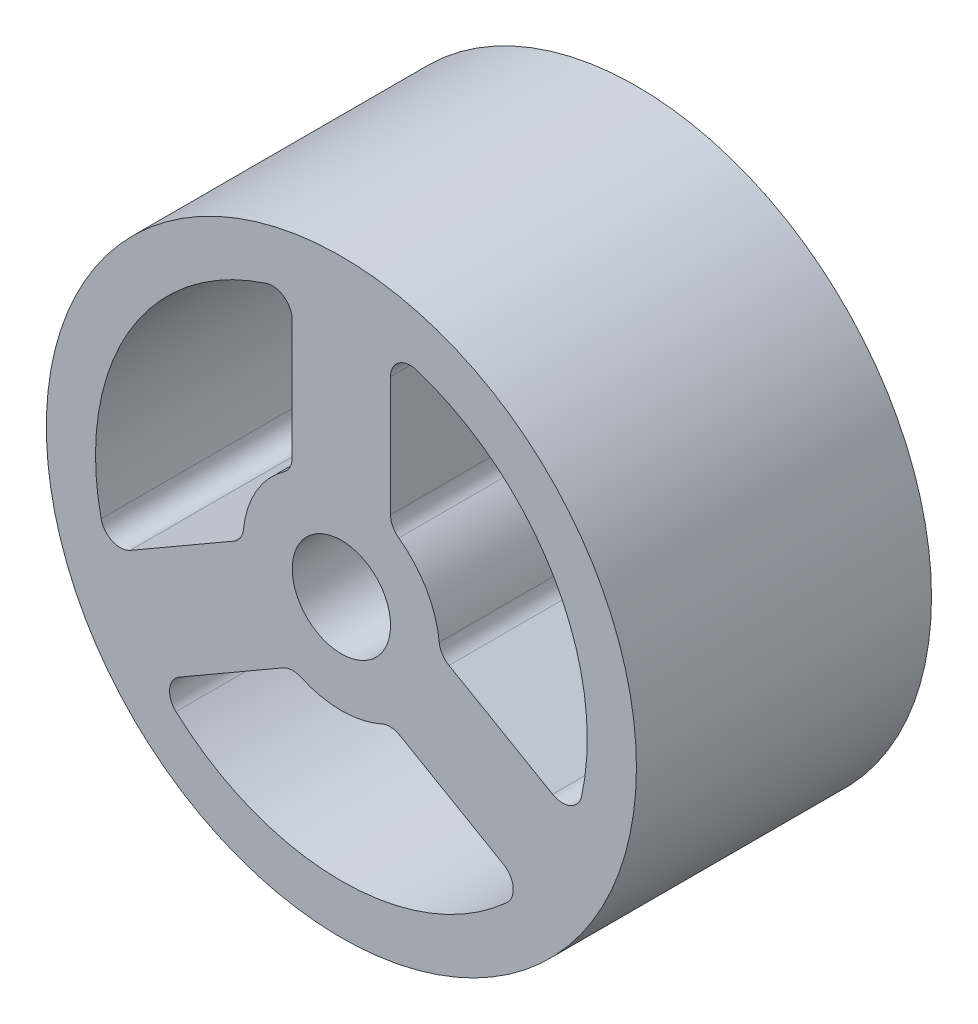
ISO-10303-21;
HEADER;
FILE_DESCRIPTION(('STEP AP214'),'2;1');
FILE_NAME('part.step','',(''),(''),'','','');
FILE_SCHEMA(('AUTOMOTIVE_DESIGN { 1 0 10303 214 1 1 1 1 }'));
ENDSEC;
DATA;
#1=APPLICATION_CONTEXT('core data for automotive mechanical design processes');
#2=APPLICATION_PROTOCOL_DEFINITION('international standard','automotive_design',2000,#1);
#3=PRODUCT_CONTEXT('',#1,'mechanical');
#4=PRODUCT('Part','Part','',(#3));
#5=PRODUCT_RELATED_PRODUCT_CATEGORY('part','',(#4));
#6=PRODUCT_DEFINITION_FORMATION('','',#4);
#7=PRODUCT_DEFINITION_CONTEXT('part definition',#1,'design');
#8=PRODUCT_DEFINITION('design','',#6,#7);
#9=PRODUCT_DEFINITION_SHAPE('','',#8);
#10=(LENGTH_UNIT() NAMED_UNIT(*) SI_UNIT(.MILLI.,.METRE.));
#11=(NAMED_UNIT(*) PLANE_ANGLE_UNIT() SI_UNIT($,.RADIAN.));
#12=(NAMED_UNIT(*) SI_UNIT($,.STERADIAN.) SOLID_ANGLE_UNIT());
#13=UNCERTAINTY_MEASURE_WITH_UNIT(LENGTH_MEASURE(1.E-05),#10,'distance_accuracy_value','');
#14=(GEOMETRIC_REPRESENTATION_CONTEXT(3) GLOBAL_UNCERTAINTY_ASSIGNED_CONTEXT((#13)) GLOBAL_UNIT_ASSIGNED_CONTEXT((#10,
#11,#12)) REPRESENTATION_CONTEXT('',''));
#15=CARTESIAN_POINT('',(0.,0.,0.));
#16=DIRECTION('',(0.,0.,1.));
#17=DIRECTION('',(1.,0.,0.));
#18=AXIS2_PLACEMENT_3D('',#15,#16,#17);
#19=CARTESIAN_POINT('',(0.,0.,30.));
#20=DIRECTION('',(0.,0.,-1.));
#21=DIRECTION('',(-1.,0.,0.));
#22=AXIS2_PLACEMENT_3D('',#19,#20,#21);
#23=CYLINDRICAL_SURFACE('',#22,10.);
#24=CARTESIAN_POINT('',(0.,0.,0.));
#25=DIRECTION('',(0.,0.,1.));
#26=DIRECTION('',(1.,0.,0.));
#27=AXIS2_PLACEMENT_3D('',#24,#25,#26);
#28=CIRCLE('',#27,10.);
#29=CARTESIAN_POINT('',(-5.83333333333333,8.12232862067414,0.));
#30=VERTEX_POINT('',#29);
#31=CARTESIAN_POINT('',(-9.95080959005588,0.990650545072255,0.));
#32=VERTEX_POINT('',#31);
#33=EDGE_CURVE('E248',#30,#32,#28,.T.);
#34=ORIENTED_EDGE('',*,*,#33,.T.);
#35=DIRECTION('',(0.,0.,-1.));
#36=VECTOR('',#35,1.);
#37=CARTESIAN_POINT('',(-9.95080959005588,0.990650545072255,30.));
#38=LINE('',#37,#36);
#39=CARTESIAN_POINT('',(-9.95080959005588,0.990650545072255,30.));
#40=VERTEX_POINT('',#39);
#41=EDGE_CURVE('E11',#40,#32,#38,.T.);
#42=ORIENTED_EDGE('',*,*,#41,.F.);
#43=CARTESIAN_POINT('',(0.,0.,30.));
#44=DIRECTION('',(0.,0.,1.));
#45=DIRECTION('',(1.,0.,0.));
#46=AXIS2_PLACEMENT_3D('',#43,#44,#45);
#47=CIRCLE('',#46,10.);
#48=CARTESIAN_POINT('',(-5.83333333333333,8.12232862067414,30.));
#49=VERTEX_POINT('',#48);
#50=EDGE_CURVE('E401',#49,#40,#47,.T.);
#51=ORIENTED_EDGE('',*,*,#50,.F.);
#52=DIRECTION('',(0.,0.,-1.));
#53=VECTOR('',#52,1.);
#54=CARTESIAN_POINT('',(-5.83333333333333,8.12232862067414,30.));
#55=LINE('',#54,#53);
#56=EDGE_CURVE('E302',#49,#30,#55,.T.);
#57=ORIENTED_EDGE('',*,*,#56,.T.);
#58=EDGE_LOOP('',(#34,#42,#51,#57));
#59=FACE_BOUND('',#58,.T.);
#60=ADVANCED_FACE('F39',(#59),#23,.T.);
#61=CARTESIAN_POINT('',(-11.9409715080671,1.18878065408671,30.));
#62=DIRECTION('',(0.,0.,-1.));
#63=DIRECTION('',(-1.,0.,0.));
#64=AXIS2_PLACEMENT_3D('',#61,#62,#63);
#65=CYLINDRICAL_SURFACE('',#64,2.);
#66=CARTESIAN_POINT('',(-11.9409715080671,1.18878065408671,0.));
#67=DIRECTION('',(0.,0.,1.));
#68=DIRECTION('',(1.,0.,0.));
#69=AXIS2_PLACEMENT_3D('',#66,#67,#68);
#70=CIRCLE('',#69,2.);
#71=CARTESIAN_POINT('',(-10.9409715080671,-0.543270153482182,0.));
#72=VERTEX_POINT('',#71);
#73=EDGE_CURVE('E283',#72,#32,#70,.T.);
#74=ORIENTED_EDGE('',*,*,#73,.F.);
#75=DIRECTION('',(0.,0.,-1.));
#76=VECTOR('',#75,1.);
#77=CARTESIAN_POINT('',(-10.9409715080671,-0.543270153482182,30.));
#78=LINE('',#77,#76);
#79=CARTESIAN_POINT('',(-10.9409715080671,-0.543270153482182,30.));
#80=VERTEX_POINT('',#79);
#81=EDGE_CURVE('E49',#80,#72,#78,.T.);
#82=ORIENTED_EDGE('',*,*,#81,.F.);
#83=CARTESIAN_POINT('',(-11.9409715080671,1.18878065408671,30.));
#84=DIRECTION('',(0.,0.,1.));
#85=DIRECTION('',(1.,0.,0.));
#86=AXIS2_PLACEMENT_3D('',#83,#84,#85);
#87=CIRCLE('',#86,2.);
#88=EDGE_CURVE('E402',#80,#40,#87,.T.);
#89=ORIENTED_EDGE('',*,*,#88,.T.);
#90=ORIENTED_EDGE('',*,*,#41,.T.);
#91=EDGE_LOOP('',(#74,#82,#89,#90));
#92=FACE_BOUND('',#91,.T.);
#93=ADVANCED_FACE('F444',(#92),#65,.F.);
#94=CARTESIAN_POINT('',(-2.49999999999996,4.33012701892222,30.));
#95=DIRECTION('',(-0.499999999999992,0.866025403784443,0.));
#96=DIRECTION('',(-0.866025403784443,-0.499999999999992,0.));
#97=AXIS2_PLACEMENT_3D('',#94,#95,#96);
#98=PLANE('',#97);
#99=DIRECTION('',(0.866025403784443,0.499999999999992,0.));
#100=VECTOR('',#99,1.);
#101=CARTESIAN_POINT('',(-2.49999999999996,4.33012701892222,0.));
#102=LINE('',#101,#100);
#103=CARTESIAN_POINT('',(-21.4736659610103,-6.62432413118093,0.));
#104=VERTEX_POINT('',#103);
#105=EDGE_CURVE('E286',#104,#72,#102,.T.);
#106=ORIENTED_EDGE('',*,*,#105,.F.);
#107=DIRECTION('',(0.,0.,-1.));
#108=VECTOR('',#107,1.);
#109=CARTESIAN_POINT('',(-21.4736659610103,-6.62432413118093,30.));
#110=LINE('',#109,#108);
#111=CARTESIAN_POINT('',(-21.4736659610103,-6.62432413118093,30.));
#112=VERTEX_POINT('',#111);
#113=EDGE_CURVE('E309',#112,#104,#110,.T.);
#114=ORIENTED_EDGE('',*,*,#113,.F.);
#115=DIRECTION('',(0.866025403784443,0.499999999999992,0.));
#116=VECTOR('',#115,1.);
#117=CARTESIAN_POINT('',(-2.49999999999996,4.33012701892222,30.));
#118=LINE('',#117,#116);
#119=EDGE_CURVE('E405',#112,#80,#118,.T.);
#120=ORIENTED_EDGE('',*,*,#119,.T.);
#121=ORIENTED_EDGE('',*,*,#81,.T.);
#122=EDGE_LOOP('',(#106,#114,#120,#121));
#123=FACE_BOUND('',#122,.T.);
#124=ADVANCED_FACE('F440',(#123),#98,.T.);
#125=CARTESIAN_POINT('',(-22.4736659610103,-4.89227332361204,30.));
#126=DIRECTION('',(0.,0.,-1.));
#127=DIRECTION('',(-1.,0.,0.));
#128=AXIS2_PLACEMENT_3D('',#125,#126,#127);
#129=CYLINDRICAL_SURFACE('',#128,2.);
#130=CARTESIAN_POINT('',(-22.4736659610103,-4.89227332361204,0.));
#131=DIRECTION('',(0.,0.,1.));
#132=DIRECTION('',(1.,0.,0.));
#133=AXIS2_PLACEMENT_3D('',#130,#131,#132);
#134=CIRCLE('',#133,2.);
#135=CARTESIAN_POINT('',(-24.4278977837069,-5.31768839523048,0.));
#136=VERTEX_POINT('',#135);
#137=EDGE_CURVE('E289',#136,#104,#134,.T.);
#138=ORIENTED_EDGE('',*,*,#137,.F.);
#139=DIRECTION('',(0.,0.,-1.));
#140=VECTOR('',#139,1.);
#141=CARTESIAN_POINT('',(-24.4278977837069,-5.31768839523048,30.));
#142=LINE('',#141,#140);
#143=CARTESIAN_POINT('',(-24.4278977837069,-5.31768839523048,30.));
#144=VERTEX_POINT('',#143);
#145=EDGE_CURVE('E307',#144,#136,#142,.T.);
#146=ORIENTED_EDGE('',*,*,#145,.F.);
#147=CARTESIAN_POINT('',(-22.4736659610103,-4.89227332361204,30.));
#148=DIRECTION('',(0.,0.,1.));
#149=DIRECTION('',(1.,0.,0.));
#150=AXIS2_PLACEMENT_3D('',#147,#148,#149);
#151=CIRCLE('',#150,2.);
#152=EDGE_CURVE('E407',#144,#112,#151,.T.);
#153=ORIENTED_EDGE('',*,*,#152,.T.);
#154=ORIENTED_EDGE('',*,*,#113,.T.);
#155=EDGE_LOOP('',(#138,#146,#153,#154));
#156=FACE_BOUND('',#155,.T.);
#157=ADVANCED_FACE('F436',(#156),#129,.F.);
#158=CARTESIAN_POINT('',(0.,0.,30.));
#159=DIRECTION('',(0.,0.,-1.));
#160=DIRECTION('',(-1.,0.,0.));
#161=AXIS2_PLACEMENT_3D('',#158,#159,#160);
#162=CYLINDRICAL_SURFACE('',#161,25.);
#163=CARTESIAN_POINT('',(0.,0.,0.));
#164=DIRECTION('',(0.,0.,1.));
#165=DIRECTION('',(1.,0.,0.));
#166=AXIS2_PLACEMENT_3D('',#163,#164,#165);
#167=CIRCLE('',#166,25.);
#168=CARTESIAN_POINT('',(-7.60869565217391,23.814024239355,0.));
#169=VERTEX_POINT('',#168);
#170=EDGE_CURVE('E262',#169,#136,#167,.T.);
#171=ORIENTED_EDGE('',*,*,#170,.F.);
#172=DIRECTION('',(0.,0.,-1.));
#173=VECTOR('',#172,1.);
#174=CARTESIAN_POINT('',(-7.60869565217391,23.814024239355,30.));
#175=LINE('',#174,#173);
#176=CARTESIAN_POINT('',(-7.60869565217391,23.814024239355,30.));
#177=VERTEX_POINT('',#176);
#178=EDGE_CURVE('E226',#177,#169,#175,.T.);
#179=ORIENTED_EDGE('',*,*,#178,.F.);
#180=CARTESIAN_POINT('',(0.,0.,30.));
#181=DIRECTION('',(0.,0.,1.));
#182=DIRECTION('',(1.,0.,0.));
#183=AXIS2_PLACEMENT_3D('',#180,#181,#182);
#184=CIRCLE('',#183,25.);
#185=EDGE_CURVE('E219',#177,#144,#184,.T.);
#186=ORIENTED_EDGE('',*,*,#185,.T.);
#187=ORIENTED_EDGE('',*,*,#145,.T.);
#188=EDGE_LOOP('',(#171,#179,#186,#187));
#189=FACE_BOUND('',#188,.T.);
#190=ADVANCED_FACE('F435',(#189),#162,.F.);
#191=CARTESIAN_POINT('',(-7.,21.9089023002066,30.));
#192=DIRECTION('',(0.,0.,-1.));
#193=DIRECTION('',(-1.,0.,0.));
#194=AXIS2_PLACEMENT_3D('',#191,#192,#193);
#195=CYLINDRICAL_SURFACE('',#194,2.);
#196=CARTESIAN_POINT('',(-7.,21.9089023002066,0.));
#197=DIRECTION('',(0.,0.,1.));
#198=DIRECTION('',(1.,0.,0.));
#199=AXIS2_PLACEMENT_3D('',#196,#197,#198);
#200=CIRCLE('',#199,2.);
#201=CARTESIAN_POINT('',(-5.,21.9089023002066,0.));
#202=VERTEX_POINT('',#201);
#203=EDGE_CURVE('E225',#169,#202,#200,.F.);
#204=ORIENTED_EDGE('',*,*,#203,.T.);
#205=DIRECTION('',(0.,0.,-1.));
#206=VECTOR('',#205,1.);
#207=CARTESIAN_POINT('',(-5.,21.9089023002066,30.));
#208=LINE('',#207,#206);
#209=CARTESIAN_POINT('',(-5.,21.9089023002066,30.));
#210=VERTEX_POINT('',#209);
#211=EDGE_CURVE('E222',#210,#202,#208,.T.);
#212=ORIENTED_EDGE('',*,*,#211,.F.);
#213=CARTESIAN_POINT('',(-7.,21.9089023002066,30.));
#214=DIRECTION('',(0.,0.,1.));
#215=DIRECTION('',(1.,0.,0.));
#216=AXIS2_PLACEMENT_3D('',#213,#214,#215);
#217=CIRCLE('',#216,2.);
#218=EDGE_CURVE('E211',#177,#210,#217,.F.);
#219=ORIENTED_EDGE('',*,*,#218,.F.);
#220=ORIENTED_EDGE('',*,*,#178,.T.);
#221=EDGE_LOOP('',(#204,#212,#219,#220));
#222=FACE_BOUND('',#221,.T.);
#223=ADVANCED_FACE('F223',(#222),#195,.F.);
#224=CARTESIAN_POINT('',(-5.,0.,30.));
#225=DIRECTION('',(1.,0.,0.));
#226=DIRECTION('',(0.,1.,0.));
#227=AXIS2_PLACEMENT_3D('',#224,#225,#226);
#228=PLANE('',#227);
#229=DIRECTION('',(0.,-1.,0.));
#230=VECTOR('',#229,1.);
#231=CARTESIAN_POINT('',(-5.,0.,0.));
#232=LINE('',#231,#230);
#233=CARTESIAN_POINT('',(-5.,9.74679434480896,0.));
#234=VERTEX_POINT('',#233);
#235=EDGE_CURVE('E134',#202,#234,#232,.T.);
#236=ORIENTED_EDGE('',*,*,#235,.T.);
#237=DIRECTION('',(0.,0.,-1.));
#238=VECTOR('',#237,1.);
#239=CARTESIAN_POINT('',(-5.,9.74679434480896,30.));
#240=LINE('',#239,#238);
#241=CARTESIAN_POINT('',(-5.,9.74679434480896,30.));
#242=VERTEX_POINT('',#241);
#243=EDGE_CURVE('E227',#242,#234,#240,.T.);
#244=ORIENTED_EDGE('',*,*,#243,.F.);
#245=DIRECTION('',(0.,-1.,0.));
#246=VECTOR('',#245,1.);
#247=CARTESIAN_POINT('',(-5.,0.,30.));
#248=LINE('',#247,#246);
#249=EDGE_CURVE('E216',#210,#242,#248,.T.);
#250=ORIENTED_EDGE('',*,*,#249,.F.);
#251=ORIENTED_EDGE('',*,*,#211,.T.);
#252=EDGE_LOOP('',(#236,#244,#250,#251));
#253=FACE_BOUND('',#252,.T.);
#254=ADVANCED_FACE('F229',(#253),#228,.F.);
#255=CARTESIAN_POINT('',(-4.94097150806717,-10.9355749988955,30.));
#256=DIRECTION('',(0.,0.,-1.));
#257=DIRECTION('',(-1.,0.,0.));
#258=AXIS2_PLACEMENT_3D('',#255,#256,#257);
#259=CYLINDRICAL_SURFACE('',#258,2.);
#260=CARTESIAN_POINT('',(-4.94097150806717,-10.9355749988955,0.));
#261=DIRECTION('',(0.,0.,1.));
#262=DIRECTION('',(1.,0.,0.));
#263=AXIS2_PLACEMENT_3D('',#260,#261,#262);
#264=CIRCLE('',#263,2.);
#265=CARTESIAN_POINT('',(-5.94097150806715,-9.20352419132662,0.));
#266=VERTEX_POINT('',#265);
#267=CARTESIAN_POINT('',(-4.11747625672264,-9.11297916574626,0.));
#268=VERTEX_POINT('',#267);
#269=EDGE_CURVE('E267',#266,#268,#264,.F.);
#270=ORIENTED_EDGE('',*,*,#269,.T.);
#271=DIRECTION('',(0.,0.,-1.));
#272=VECTOR('',#271,1.);
#273=CARTESIAN_POINT('',(-4.11747625672264,-9.11297916574626,30.));
#274=LINE('',#273,#272);
#275=CARTESIAN_POINT('',(-4.11747625672264,-9.11297916574626,30.));
#276=VERTEX_POINT('',#275);
#277=EDGE_CURVE('E304',#276,#268,#274,.T.);
#278=ORIENTED_EDGE('',*,*,#277,.F.);
#279=CARTESIAN_POINT('',(-4.94097150806717,-10.9355749988955,30.));
#280=DIRECTION('',(0.,0.,1.));
#281=DIRECTION('',(1.,0.,0.));
#282=AXIS2_PLACEMENT_3D('',#279,#280,#281);
#283=CIRCLE('',#282,2.);
#284=CARTESIAN_POINT('',(-5.94097150806715,-9.20352419132662,30.));
#285=VERTEX_POINT('',#284);
#286=EDGE_CURVE('E384',#285,#276,#283,.F.);
#287=ORIENTED_EDGE('',*,*,#286,.F.);
#288=DIRECTION('',(0.,0.,-1.));
#289=VECTOR('',#288,1.);
#290=CARTESIAN_POINT('',(-5.94097150806715,-9.20352419132662,30.));
#291=LINE('',#290,#289);
#292=EDGE_CURVE('E312',#285,#266,#291,.T.);
#293=ORIENTED_EDGE('',*,*,#292,.T.);
#294=EDGE_LOOP('',(#270,#278,#287,#293));
#295=FACE_BOUND('',#294,.T.);
#296=ADVANCED_FACE('F476',(#295),#259,.F.);
#297=CARTESIAN_POINT('',(4.11747625672251,-9.11297916574631,0.));
#298=VERTEX_POINT('',#297);
#299=EDGE_CURVE('E249',#268,#298,#28,.T.);
#300=ORIENTED_EDGE('',*,*,#299,.T.);
#301=DIRECTION('',(0.,0.,-1.));
#302=VECTOR('',#301,1.);
#303=CARTESIAN_POINT('',(4.11747625672251,-9.11297916574631,30.));
#304=LINE('',#303,#302);
#305=CARTESIAN_POINT('',(4.11747625672251,-9.11297916574631,30.));
#306=VERTEX_POINT('',#305);
#307=EDGE_CURVE('E326',#306,#298,#304,.T.);
#308=ORIENTED_EDGE('',*,*,#307,.F.);
#309=EDGE_CURVE('E387',#276,#306,#47,.T.);
#310=ORIENTED_EDGE('',*,*,#309,.F.);
#311=ORIENTED_EDGE('',*,*,#277,.T.);
#312=EDGE_LOOP('',(#300,#308,#310,#311));
#313=FACE_BOUND('',#312,.T.);
#314=ADVANCED_FACE('F452',(#313),#23,.T.);
#315=CARTESIAN_POINT('',(4.94097150806701,-10.9355749988956,30.));
#316=DIRECTION('',(0.,0.,-1.));
#317=DIRECTION('',(-1.,0.,0.));
#318=AXIS2_PLACEMENT_3D('',#315,#316,#317);
#319=CYLINDRICAL_SURFACE('',#318,2.);
#320=CARTESIAN_POINT('',(4.94097150806701,-10.9355749988956,0.));
#321=DIRECTION('',(0.,0.,1.));
#322=DIRECTION('',(1.,0.,0.));
#323=AXIS2_PLACEMENT_3D('',#320,#321,#322);
#324=CIRCLE('',#323,2.);
#325=CARTESIAN_POINT('',(5.94097150806702,-9.2035241913267,0.));
#326=VERTEX_POINT('',#325);
#327=EDGE_CURVE('E270',#326,#298,#324,.T.);
#328=ORIENTED_EDGE('',*,*,#327,.F.);
#329=DIRECTION('',(0.,0.,-1.));
#330=VECTOR('',#329,1.);
#331=CARTESIAN_POINT('',(5.94097150806702,-9.2035241913267,30.));
#332=LINE('',#331,#330);
#333=CARTESIAN_POINT('',(5.94097150806702,-9.2035241913267,30.));
#334=VERTEX_POINT('',#333);
#335=EDGE_CURVE('E324',#334,#326,#332,.T.);
#336=ORIENTED_EDGE('',*,*,#335,.F.);
#337=CARTESIAN_POINT('',(4.94097150806701,-10.9355749988956,30.));
#338=DIRECTION('',(0.,0.,1.));
#339=DIRECTION('',(1.,0.,0.));
#340=AXIS2_PLACEMENT_3D('',#337,#338,#339);
#341=CIRCLE('',#340,2.);
#342=EDGE_CURVE('E388',#334,#306,#341,.T.);
#343=ORIENTED_EDGE('',*,*,#342,.T.);
#344=ORIENTED_EDGE('',*,*,#307,.T.);
#345=EDGE_LOOP('',(#328,#336,#343,#344));
#346=FACE_BOUND('',#345,.T.);
#347=ADVANCED_FACE('F456',(#346),#319,.F.);
#348=CARTESIAN_POINT('',(-2.50000000000002,-4.33012701892219,30.));
#349=DIRECTION('',(-0.500000000000004,-0.866025403784437,0.));
#350=DIRECTION('',(0.866025403784437,-0.500000000000004,0.));
#351=AXIS2_PLACEMENT_3D('',#348,#349,#350);
#352=PLANE('',#351);
#353=DIRECTION('',(-0.866025403784437,0.500000000000004,0.));
#354=VECTOR('',#353,1.);
#355=CARTESIAN_POINT('',(-2.50000000000002,-4.33012701892219,0.));
#356=LINE('',#355,#354);
#357=CARTESIAN_POINT('',(16.4736659610102,-15.2845781690256,0.));
#358=VERTEX_POINT('',#357);
#359=EDGE_CURVE('E273',#358,#326,#356,.T.);
#360=ORIENTED_EDGE('',*,*,#359,.F.);
#361=DIRECTION('',(0.,0.,-1.));
#362=VECTOR('',#361,1.);
#363=CARTESIAN_POINT('',(16.4736659610102,-15.2845781690256,30.));
#364=LINE('',#363,#362);
#365=CARTESIAN_POINT('',(16.4736659610102,-15.2845781690256,30.));
#366=VERTEX_POINT('',#365);
#367=EDGE_CURVE('E322',#366,#358,#364,.T.);
#368=ORIENTED_EDGE('',*,*,#367,.F.);
#369=DIRECTION('',(-0.866025403784437,0.500000000000004,0.));
#370=VECTOR('',#369,1.);
#371=CARTESIAN_POINT('',(-2.50000000000002,-4.33012701892219,30.));
#372=LINE('',#371,#370);
#373=EDGE_CURVE('E391',#366,#334,#372,.T.);
#374=ORIENTED_EDGE('',*,*,#373,.T.);
#375=ORIENTED_EDGE('',*,*,#335,.T.);
#376=EDGE_LOOP('',(#360,#368,#374,#375));
#377=FACE_BOUND('',#376,.T.);
#378=ADVANCED_FACE('F458',(#377),#352,.T.);
#379=CARTESIAN_POINT('',(15.4736659610102,-17.0166289765945,30.));
#380=DIRECTION('',(0.,0.,-1.));
#381=DIRECTION('',(-1.,0.,0.));
#382=AXIS2_PLACEMENT_3D('',#379,#380,#381);
#383=CYLINDRICAL_SURFACE('',#382,2.);
#384=CARTESIAN_POINT('',(15.4736659610102,-17.0166289765945,0.));
#385=DIRECTION('',(0.,0.,1.));
#386=DIRECTION('',(1.,0.,0.));
#387=AXIS2_PLACEMENT_3D('',#384,#385,#386);
#388=CIRCLE('',#387,2.);
#389=CARTESIAN_POINT('',(16.8192021315328,-18.4963358441244,0.));
#390=VERTEX_POINT('',#389);
#391=EDGE_CURVE('E276',#390,#358,#388,.T.);
#392=ORIENTED_EDGE('',*,*,#391,.F.);
#393=DIRECTION('',(0.,0.,-1.));
#394=VECTOR('',#393,1.);
#395=CARTESIAN_POINT('',(16.8192021315328,-18.4963358441244,30.));
#396=LINE('',#395,#394);
#397=CARTESIAN_POINT('',(16.8192021315328,-18.4963358441244,30.));
#398=VERTEX_POINT('',#397);
#399=EDGE_CURVE('E320',#398,#390,#396,.T.);
#400=ORIENTED_EDGE('',*,*,#399,.F.);
#401=CARTESIAN_POINT('',(15.4736659610102,-17.0166289765945,30.));
#402=DIRECTION('',(0.,0.,1.));
#403=DIRECTION('',(1.,0.,0.));
#404=AXIS2_PLACEMENT_3D('',#401,#402,#403);
#405=CIRCLE('',#404,2.);
#406=EDGE_CURVE('E394',#398,#366,#405,.T.);
#407=ORIENTED_EDGE('',*,*,#406,.T.);
#408=ORIENTED_EDGE('',*,*,#367,.T.);
#409=EDGE_LOOP('',(#392,#400,#407,#408));
#410=FACE_BOUND('',#409,.T.);
#411=ADVANCED_FACE('F423',(#410),#383,.F.);
#412=CARTESIAN_POINT('',(-16.8192021315331,-18.4963358441242,0.));
#413=VERTEX_POINT('',#412);
#414=EDGE_CURVE('E263',#413,#390,#167,.T.);
#415=ORIENTED_EDGE('',*,*,#414,.F.);
#416=DIRECTION('',(0.,0.,-1.));
#417=VECTOR('',#416,1.);
#418=CARTESIAN_POINT('',(-16.8192021315331,-18.4963358441242,30.));
#419=LINE('',#418,#417);
#420=CARTESIAN_POINT('',(-16.8192021315331,-18.4963358441242,30.));
#421=VERTEX_POINT('',#420);
#422=EDGE_CURVE('E318',#421,#413,#419,.T.);
#423=ORIENTED_EDGE('',*,*,#422,.F.);
#424=EDGE_CURVE('E380',#421,#398,#184,.T.);
#425=ORIENTED_EDGE('',*,*,#424,.T.);
#426=ORIENTED_EDGE('',*,*,#399,.T.);
#427=EDGE_LOOP('',(#415,#423,#425,#426));
#428=FACE_BOUND('',#427,.T.);
#429=ADVANCED_FACE('F415',(#428),#162,.F.);
#430=CARTESIAN_POINT('',(-15.4736659610104,-17.0166289765942,30.));
#431=DIRECTION('',(0.,0.,-1.));
#432=DIRECTION('',(-1.,0.,0.));
#433=AXIS2_PLACEMENT_3D('',#430,#431,#432);
#434=CYLINDRICAL_SURFACE('',#433,2.);
#435=CARTESIAN_POINT('',(-15.4736659610104,-17.0166289765942,0.));
#436=DIRECTION('',(0.,0.,1.));
#437=DIRECTION('',(1.,0.,0.));
#438=AXIS2_PLACEMENT_3D('',#435,#436,#437);
#439=CIRCLE('',#438,2.);
#440=CARTESIAN_POINT('',(-16.4736659610104,-15.2845781690254,0.));
#441=VERTEX_POINT('',#440);
#442=EDGE_CURVE('E279',#413,#441,#439,.F.);
#443=ORIENTED_EDGE('',*,*,#442,.T.);
#444=DIRECTION('',(0.,0.,-1.));
#445=VECTOR('',#444,1.);
#446=CARTESIAN_POINT('',(-16.4736659610104,-15.2845781690254,30.));
#447=LINE('',#446,#445);
#448=CARTESIAN_POINT('',(-16.4736659610104,-15.2845781690254,30.));
#449=VERTEX_POINT('',#448);
#450=EDGE_CURVE('E315',#449,#441,#447,.T.);
#451=ORIENTED_EDGE('',*,*,#450,.F.);
#452=CARTESIAN_POINT('',(-15.4736659610104,-17.0166289765942,30.));
#453=DIRECTION('',(0.,0.,1.));
#454=DIRECTION('',(1.,0.,0.));
#455=AXIS2_PLACEMENT_3D('',#452,#453,#454);
#456=CIRCLE('',#455,2.);
#457=EDGE_CURVE('E397',#421,#449,#456,.F.);
#458=ORIENTED_EDGE('',*,*,#457,.F.);
#459=ORIENTED_EDGE('',*,*,#422,.T.);
#460=EDGE_LOOP('',(#443,#451,#458,#459));
#461=FACE_BOUND('',#460,.T.);
#462=ADVANCED_FACE('F664',(#461),#434,.F.);
#463=CARTESIAN_POINT('',(11.9409715080671,1.18878065408654,30.));
#464=DIRECTION('',(0.,0.,-1.));
#465=DIRECTION('',(-1.,0.,0.));
#466=AXIS2_PLACEMENT_3D('',#463,#464,#465);
#467=CYLINDRICAL_SURFACE('',#466,2.);
#468=CARTESIAN_POINT('',(11.9409715080671,1.18878065408654,0.));
#469=DIRECTION('',(0.,0.,1.));
#470=DIRECTION('',(1.,0.,0.));
#471=AXIS2_PLACEMENT_3D('',#468,#469,#470);
#472=CIRCLE('',#471,2.);
#473=CARTESIAN_POINT('',(10.9409715080671,-0.543270153482338,0.));
#474=VERTEX_POINT('',#473);
#475=CARTESIAN_POINT('',(9.9508095900559,0.990650545072113,0.));
#476=VERTEX_POINT('',#475);
#477=EDGE_CURVE('E241',#474,#476,#472,.F.);
#478=ORIENTED_EDGE('',*,*,#477,.T.);
#479=DIRECTION('',(0.,0.,-1.));
#480=VECTOR('',#479,1.);
#481=CARTESIAN_POINT('',(9.9508095900559,0.990650545072113,30.));
#482=LINE('',#481,#480);
#483=CARTESIAN_POINT('',(9.9508095900559,0.990650545072113,30.));
#484=VERTEX_POINT('',#483);
#485=EDGE_CURVE('E43',#484,#476,#482,.T.);
#486=ORIENTED_EDGE('',*,*,#485,.F.);
#487=CARTESIAN_POINT('',(11.9409715080671,1.18878065408654,30.));
#488=DIRECTION('',(0.,0.,1.));
#489=DIRECTION('',(1.,0.,0.));
#490=AXIS2_PLACEMENT_3D('',#487,#488,#489);
#491=CIRCLE('',#490,2.);
#492=CARTESIAN_POINT('',(10.9409715080671,-0.543270153482338,30.));
#493=VERTEX_POINT('',#492);
#494=EDGE_CURVE('E301',#493,#484,#491,.F.);
#495=ORIENTED_EDGE('',*,*,#494,.F.);
#496=DIRECTION('',(0.,0.,-1.));
#497=VECTOR('',#496,1.);
#498=CARTESIAN_POINT('',(10.9409715080671,-0.543270153482338,30.));
#499=LINE('',#498,#497);
#500=EDGE_CURVE('E240',#493,#474,#499,.T.);
#501=ORIENTED_EDGE('',*,*,#500,.T.);
#502=EDGE_LOOP('',(#478,#486,#495,#501));
#503=FACE_BOUND('',#502,.T.);
#504=ADVANCED_FACE('F41',(#503),#467,.F.);
#505=CARTESIAN_POINT('',(5.83333333333334,8.12232862067413,0.));
#506=VERTEX_POINT('',#505);
#507=EDGE_CURVE('E244',#476,#506,#28,.T.);
#508=ORIENTED_EDGE('',*,*,#507,.T.);
#509=DIRECTION('',(0.,0.,-1.));
#510=VECTOR('',#509,1.);
#511=CARTESIAN_POINT('',(5.83333333333334,8.12232862067413,30.));
#512=LINE('',#511,#510);
#513=CARTESIAN_POINT('',(5.83333333333334,8.12232862067413,30.));
#514=VERTEX_POINT('',#513);
#515=EDGE_CURVE('E342',#514,#506,#512,.T.);
#516=ORIENTED_EDGE('',*,*,#515,.F.);
#517=EDGE_CURVE('E149',#484,#514,#47,.T.);
#518=ORIENTED_EDGE('',*,*,#517,.F.);
#519=ORIENTED_EDGE('',*,*,#485,.T.);
#520=EDGE_LOOP('',(#508,#516,#518,#519));
#521=FACE_BOUND('',#520,.T.);
#522=ADVANCED_FACE('F347',(#521),#23,.T.);
#523=CARTESIAN_POINT('',(7.,9.74679434480896,30.));
#524=DIRECTION('',(0.,0.,-1.));
#525=DIRECTION('',(-1.,0.,0.));
#526=AXIS2_PLACEMENT_3D('',#523,#524,#525);
#527=CYLINDRICAL_SURFACE('',#526,2.);
#528=CARTESIAN_POINT('',(7.,9.74679434480896,0.));
#529=DIRECTION('',(0.,0.,1.));
#530=DIRECTION('',(1.,0.,0.));
#531=AXIS2_PLACEMENT_3D('',#528,#529,#530);
#532=CIRCLE('',#531,2.);
#533=CARTESIAN_POINT('',(5.,9.74679434480896,0.));
#534=VERTEX_POINT('',#533);
#535=EDGE_CURVE('E247',#534,#506,#532,.T.);
#536=ORIENTED_EDGE('',*,*,#535,.F.);
#537=DIRECTION('',(0.,0.,-1.));
#538=VECTOR('',#537,1.);
#539=CARTESIAN_POINT('',(5.,9.74679434480896,30.));
#540=LINE('',#539,#538);
#541=CARTESIAN_POINT('',(5.,9.74679434480896,30.));
#542=VERTEX_POINT('',#541);
#543=EDGE_CURVE('E341',#542,#534,#540,.T.);
#544=ORIENTED_EDGE('',*,*,#543,.F.);
#545=CARTESIAN_POINT('',(7.,9.74679434480896,30.));
#546=DIRECTION('',(0.,0.,1.));
#547=DIRECTION('',(1.,0.,0.));
#548=AXIS2_PLACEMENT_3D('',#545,#546,#547);
#549=CIRCLE('',#548,2.);
#550=EDGE_CURVE('E360',#542,#514,#549,.T.);
#551=ORIENTED_EDGE('',*,*,#550,.T.);
#552=ORIENTED_EDGE('',*,*,#515,.T.);
#553=EDGE_LOOP('',(#536,#544,#551,#552));
#554=FACE_BOUND('',#553,.T.);
#555=ADVANCED_FACE('F358',(#554),#527,.F.);
#556=CARTESIAN_POINT('',(5.,0.,30.));
#557=DIRECTION('',(1.,0.,0.));
#558=DIRECTION('',(0.,1.,0.));
#559=AXIS2_PLACEMENT_3D('',#556,#557,#558);
#560=PLANE('',#559);
#561=DIRECTION('',(0.,-1.,0.));
#562=VECTOR('',#561,1.);
#563=CARTESIAN_POINT('',(5.,0.,0.));
#564=LINE('',#563,#562);
#565=CARTESIAN_POINT('',(5.,21.9089023002066,0.));
#566=VERTEX_POINT('',#565);
#567=EDGE_CURVE('E252',#566,#534,#564,.T.);
#568=ORIENTED_EDGE('',*,*,#567,.F.);
#569=DIRECTION('',(0.,0.,-1.));
#570=VECTOR('',#569,1.);
#571=CARTESIAN_POINT('',(5.,21.9089023002066,30.));
#572=LINE('',#571,#570);
#573=CARTESIAN_POINT('',(5.,21.9089023002066,30.));
#574=VERTEX_POINT('',#573);
#575=EDGE_CURVE('E339',#574,#566,#572,.T.);
#576=ORIENTED_EDGE('',*,*,#575,.F.);
#577=DIRECTION('',(0.,-1.,0.));
#578=VECTOR('',#577,1.);
#579=CARTESIAN_POINT('',(5.,0.,30.));
#580=LINE('',#579,#578);
#581=EDGE_CURVE('E367',#574,#542,#580,.T.);
#582=ORIENTED_EDGE('',*,*,#581,.T.);
#583=ORIENTED_EDGE('',*,*,#543,.T.);
#584=EDGE_LOOP('',(#568,#576,#582,#583));
#585=FACE_BOUND('',#584,.T.);
#586=ADVANCED_FACE('F370',(#585),#560,.T.);
#587=CARTESIAN_POINT('',(7.,21.9089023002066,30.));
#588=DIRECTION('',(0.,0.,-1.));
#589=DIRECTION('',(-1.,0.,0.));
#590=AXIS2_PLACEMENT_3D('',#587,#588,#589);
#591=CYLINDRICAL_SURFACE('',#590,2.);
#592=CARTESIAN_POINT('',(7.,21.9089023002066,0.));
#593=DIRECTION('',(0.,0.,1.));
#594=DIRECTION('',(1.,0.,0.));
#595=AXIS2_PLACEMENT_3D('',#592,#593,#594);
#596=CIRCLE('',#595,2.);
#597=CARTESIAN_POINT('',(7.60869565217391,23.814024239355,0.));
#598=VERTEX_POINT('',#597);
#599=EDGE_CURVE('E255',#598,#566,#596,.T.);
#600=ORIENTED_EDGE('',*,*,#599,.F.);
#601=DIRECTION('',(0.,0.,-1.));
#602=VECTOR('',#601,1.);
#603=CARTESIAN_POINT('',(7.60869565217391,23.814024239355,30.));
#604=LINE('',#603,#602);
#605=CARTESIAN_POINT('',(7.60869565217391,23.814024239355,30.));
#606=VERTEX_POINT('',#605);
#607=EDGE_CURVE('E337',#606,#598,#604,.T.);
#608=ORIENTED_EDGE('',*,*,#607,.F.);
#609=CARTESIAN_POINT('',(7.,21.9089023002066,30.));
#610=DIRECTION('',(0.,0.,1.));
#611=DIRECTION('',(1.,0.,0.));
#612=AXIS2_PLACEMENT_3D('',#609,#610,#611);
#613=CIRCLE('',#612,2.);
#614=EDGE_CURVE('E371',#606,#574,#613,.T.);
#615=ORIENTED_EDGE('',*,*,#614,.T.);
#616=ORIENTED_EDGE('',*,*,#575,.T.);
#617=EDGE_LOOP('',(#600,#608,#615,#616));
#618=FACE_BOUND('',#617,.T.);
#619=ADVANCED_FACE('F499',(#618),#591,.F.);
#620=CARTESIAN_POINT('',(24.4278977837068,-5.31768839523082,0.));
#621=VERTEX_POINT('',#620);
#622=EDGE_CURVE('E258',#621,#598,#167,.T.);
#623=ORIENTED_EDGE('',*,*,#622,.F.);
#624=DIRECTION('',(0.,0.,-1.));
#625=VECTOR('',#624,1.);
#626=CARTESIAN_POINT('',(24.4278977837068,-5.31768839523082,30.));
#627=LINE('',#626,#625);
#628=CARTESIAN_POINT('',(24.4278977837068,-5.31768839523082,30.));
#629=VERTEX_POINT('',#628);
#630=EDGE_CURVE('E335',#629,#621,#627,.T.);
#631=ORIENTED_EDGE('',*,*,#630,.F.);
#632=EDGE_CURVE('E373',#629,#606,#184,.T.);
#633=ORIENTED_EDGE('',*,*,#632,.T.);
#634=ORIENTED_EDGE('',*,*,#607,.T.);
#635=EDGE_LOOP('',(#623,#631,#633,#634));
#636=FACE_BOUND('',#635,.T.);
#637=ADVANCED_FACE('F497',(#636),#162,.F.);
#638=CARTESIAN_POINT('',(22.4736659610103,-4.89227332361235,30.));
#639=DIRECTION('',(0.,0.,-1.));
#640=DIRECTION('',(-1.,0.,0.));
#641=AXIS2_PLACEMENT_3D('',#638,#639,#640);
#642=CYLINDRICAL_SURFACE('',#641,2.);
#643=CARTESIAN_POINT('',(22.4736659610103,-4.89227332361235,0.));
#644=DIRECTION('',(0.,0.,1.));
#645=DIRECTION('',(1.,0.,0.));
#646=AXIS2_PLACEMENT_3D('',#643,#644,#645);
#647=CIRCLE('',#646,2.);
#648=CARTESIAN_POINT('',(21.4736659610103,-6.62432413118123,0.));
#649=VERTEX_POINT('',#648);
#650=EDGE_CURVE('E261',#621,#649,#647,.F.);
#651=ORIENTED_EDGE('',*,*,#650,.T.);
#652=DIRECTION('',(0.,0.,-1.));
#653=VECTOR('',#652,1.);
#654=CARTESIAN_POINT('',(21.4736659610103,-6.62432413118123,30.));
#655=LINE('',#654,#653);
#656=CARTESIAN_POINT('',(21.4736659610103,-6.62432413118123,30.));
#657=VERTEX_POINT('',#656);
#658=EDGE_CURVE('E332',#657,#649,#655,.T.);
#659=ORIENTED_EDGE('',*,*,#658,.F.);
#660=CARTESIAN_POINT('',(22.4736659610103,-4.89227332361235,30.));
#661=DIRECTION('',(0.,0.,1.));
#662=DIRECTION('',(1.,0.,0.));
#663=AXIS2_PLACEMENT_3D('',#660,#661,#662);
#664=CIRCLE('',#663,2.);
#665=EDGE_CURVE('E379',#629,#657,#664,.F.);
#666=ORIENTED_EDGE('',*,*,#665,.F.);
#667=ORIENTED_EDGE('',*,*,#630,.T.);
#668=EDGE_LOOP('',(#651,#659,#666,#667));
#669=FACE_BOUND('',#668,.T.);
#670=ADVANCED_FACE('F493',(#669),#642,.F.);
#671=CARTESIAN_POINT('',(0.,0.,30.));
#672=DIRECTION('',(0.,0.,-1.));
#673=DIRECTION('',(-1.,0.,0.));
#674=AXIS2_PLACEMENT_3D('',#671,#672,#673);
#675=CYLINDRICAL_SURFACE('',#674,30.);
#676=CARTESIAN_POINT('',(0.,0.,30.));
#677=DIRECTION('',(0.,0.,1.));
#678=DIRECTION('',(1.,0.,0.));
#679=AXIS2_PLACEMENT_3D('',#676,#677,#678);
#680=CIRCLE('',#679,30.);
#681=CARTESIAN_POINT('',(30.,0.,30.));
#682=VERTEX_POINT('',#681);
#683=EDGE_CURVE('E231',#682,#682,#680,.T.);
#684=ORIENTED_EDGE('',*,*,#683,.F.);
#685=EDGE_LOOP('',(#684));
#686=FACE_BOUND('',#685,.T.);
#687=CARTESIAN_POINT('',(0.,0.,0.));
#688=DIRECTION('',(0.,0.,1.));
#689=DIRECTION('',(1.,0.,0.));
#690=AXIS2_PLACEMENT_3D('',#687,#688,#689);
#691=CIRCLE('',#690,30.);
#692=CARTESIAN_POINT('',(30.,0.,0.));
#693=VERTEX_POINT('',#692);
#694=EDGE_CURVE('E295',#693,#693,#691,.T.);
#695=ORIENTED_EDGE('',*,*,#694,.T.);
#696=EDGE_LOOP('',(#695));
#697=FACE_BOUND('',#696,.T.);
#698=ADVANCED_FACE('F496',(#686,#697),#675,.T.);
#699=CARTESIAN_POINT('',(-7.,9.74679434480896,30.));
#700=DIRECTION('',(0.,0.,-1.));
#701=DIRECTION('',(-1.,0.,0.));
#702=AXIS2_PLACEMENT_3D('',#699,#700,#701);
#703=CYLINDRICAL_SURFACE('',#702,2.);
#704=CARTESIAN_POINT('',(-7.,9.74679434480896,0.));
#705=DIRECTION('',(0.,0.,1.));
#706=DIRECTION('',(1.,0.,0.));
#707=AXIS2_PLACEMENT_3D('',#704,#705,#706);
#708=CIRCLE('',#707,2.);
#709=EDGE_CURVE('E140',#234,#30,#708,.F.);
#710=ORIENTED_EDGE('',*,*,#709,.T.);
#711=ORIENTED_EDGE('',*,*,#56,.F.);
#712=CARTESIAN_POINT('',(-7.,9.74679434480896,30.));
#713=DIRECTION('',(0.,0.,1.));
#714=DIRECTION('',(1.,0.,0.));
#715=AXIS2_PLACEMENT_3D('',#712,#713,#714);
#716=CIRCLE('',#715,2.);
#717=EDGE_CURVE('E58',#242,#49,#716,.F.);
#718=ORIENTED_EDGE('',*,*,#717,.F.);
#719=ORIENTED_EDGE('',*,*,#243,.T.);
#720=EDGE_LOOP('',(#710,#711,#718,#719));
#721=FACE_BOUND('',#720,.T.);
#722=ADVANCED_FACE('F535',(#721),#703,.F.);
#723=CARTESIAN_POINT('',(2.49999999999996,-4.33012701892222,30.));
#724=DIRECTION('',(-0.499999999999992,0.866025403784443,0.));
#725=DIRECTION('',(-0.866025403784443,-0.499999999999992,0.));
#726=AXIS2_PLACEMENT_3D('',#723,#724,#725);
#727=PLANE('',#726);
#728=DIRECTION('',(0.866025403784443,0.499999999999992,0.));
#729=VECTOR('',#728,1.);
#730=CARTESIAN_POINT('',(2.49999999999996,-4.33012701892222,0.));
#731=LINE('',#730,#729);
#732=EDGE_CURVE('E281',#441,#266,#731,.T.);
#733=ORIENTED_EDGE('',*,*,#732,.T.);
#734=ORIENTED_EDGE('',*,*,#292,.F.);
#735=DIRECTION('',(0.866025403784443,0.499999999999992,0.));
#736=VECTOR('',#735,1.);
#737=CARTESIAN_POINT('',(2.49999999999996,-4.33012701892222,30.));
#738=LINE('',#737,#736);
#739=EDGE_CURVE('E399',#449,#285,#738,.T.);
#740=ORIENTED_EDGE('',*,*,#739,.F.);
#741=ORIENTED_EDGE('',*,*,#450,.T.);
#742=EDGE_LOOP('',(#733,#734,#740,#741));
#743=FACE_BOUND('',#742,.T.);
#744=ADVANCED_FACE('F491',(#743),#727,.F.);
#745=CARTESIAN_POINT('',(2.50000000000002,4.33012701892218,30.));
#746=DIRECTION('',(-0.500000000000004,-0.866025403784436,0.));
#747=DIRECTION('',(0.866025403784436,-0.500000000000004,0.));
#748=AXIS2_PLACEMENT_3D('',#745,#746,#747);
#749=PLANE('',#748);
#750=DIRECTION('',(-0.866025403784436,0.500000000000004,0.));
#751=VECTOR('',#750,1.);
#752=CARTESIAN_POINT('',(2.50000000000002,4.33012701892218,0.));
#753=LINE('',#752,#751);
#754=EDGE_CURVE('E265',#649,#474,#753,.T.);
#755=ORIENTED_EDGE('',*,*,#754,.T.);
#756=ORIENTED_EDGE('',*,*,#500,.F.);
#757=DIRECTION('',(-0.866025403784436,0.500000000000004,0.));
#758=VECTOR('',#757,1.);
#759=CARTESIAN_POINT('',(2.50000000000002,4.33012701892218,30.));
#760=LINE('',#759,#758);
#761=EDGE_CURVE('E382',#657,#493,#760,.T.);
#762=ORIENTED_EDGE('',*,*,#761,.F.);
#763=ORIENTED_EDGE('',*,*,#658,.T.);
#764=EDGE_LOOP('',(#755,#756,#762,#763));
#765=FACE_BOUND('',#764,.T.);
#766=ADVANCED_FACE('F487',(#765),#749,.F.);
#767=CARTESIAN_POINT('',(0.,0.,30.));
#768=DIRECTION('',(0.,0.,-1.));
#769=DIRECTION('',(-1.,0.,0.));
#770=AXIS2_PLACEMENT_3D('',#767,#768,#769);
#771=CYLINDRICAL_SURFACE('',#770,5.);
#772=CARTESIAN_POINT('',(0.,0.,30.));
#773=DIRECTION('',(0.,0.,1.));
#774=DIRECTION('',(1.,0.,0.));
#775=AXIS2_PLACEMENT_3D('',#772,#773,#774);
#776=CIRCLE('',#775,5.);
#777=CARTESIAN_POINT('',(5.,0.,30.));
#778=VERTEX_POINT('',#777);
#779=EDGE_CURVE('E237',#778,#778,#776,.T.);
#780=ORIENTED_EDGE('',*,*,#779,.T.);
#781=EDGE_LOOP('',(#780));
#782=FACE_BOUND('',#781,.T.);
#783=CARTESIAN_POINT('',(0.,0.,0.));
#784=DIRECTION('',(0.,0.,1.));
#785=DIRECTION('',(1.,0.,0.));
#786=AXIS2_PLACEMENT_3D('',#783,#784,#785);
#787=CIRCLE('',#786,5.);
#788=CARTESIAN_POINT('',(5.,0.,0.));
#789=VERTEX_POINT('',#788);
#790=EDGE_CURVE('E298',#789,#789,#787,.T.);
#791=ORIENTED_EDGE('',*,*,#790,.F.);
#792=EDGE_LOOP('',(#791));
#793=FACE_BOUND('',#792,.T.);
#794=ADVANCED_FACE('F490',(#782,#793),#771,.F.);
#795=CARTESIAN_POINT('',(0.,0.,30.));
#796=DIRECTION('',(0.,0.,1.));
#797=DIRECTION('',(1.,0.,0.));
#798=AXIS2_PLACEMENT_3D('',#795,#796,#797);
#799=PLANE('',#798);
#800=ORIENTED_EDGE('',*,*,#494,.T.);
#801=ORIENTED_EDGE('',*,*,#517,.T.);
#802=ORIENTED_EDGE('',*,*,#550,.F.);
#803=ORIENTED_EDGE('',*,*,#581,.F.);
#804=ORIENTED_EDGE('',*,*,#614,.F.);
#805=ORIENTED_EDGE('',*,*,#632,.F.);
#806=ORIENTED_EDGE('',*,*,#665,.T.);
#807=ORIENTED_EDGE('',*,*,#761,.T.);
#808=EDGE_LOOP('',(#800,#801,#802,#803,#804,#805,#806,#807));
#809=FACE_BOUND('',#808,.T.);
#810=ORIENTED_EDGE('',*,*,#286,.T.);
#811=ORIENTED_EDGE('',*,*,#309,.T.);
#812=ORIENTED_EDGE('',*,*,#342,.F.);
#813=ORIENTED_EDGE('',*,*,#373,.F.);
#814=ORIENTED_EDGE('',*,*,#406,.F.);
#815=ORIENTED_EDGE('',*,*,#424,.F.);
#816=ORIENTED_EDGE('',*,*,#457,.T.);
#817=ORIENTED_EDGE('',*,*,#739,.T.);
#818=EDGE_LOOP('',(#810,#811,#812,#813,#814,#815,#816,#817));
#819=FACE_BOUND('',#818,.T.);
#820=ORIENTED_EDGE('',*,*,#50,.T.);
#821=ORIENTED_EDGE('',*,*,#88,.F.);
#822=ORIENTED_EDGE('',*,*,#119,.F.);
#823=ORIENTED_EDGE('',*,*,#152,.F.);
#824=ORIENTED_EDGE('',*,*,#185,.F.);
#825=ORIENTED_EDGE('',*,*,#218,.T.);
#826=ORIENTED_EDGE('',*,*,#249,.T.);
#827=ORIENTED_EDGE('',*,*,#717,.T.);
#828=EDGE_LOOP('',(#820,#821,#822,#823,#824,#825,#826,#827));
#829=FACE_BOUND('',#828,.T.);
#830=ORIENTED_EDGE('',*,*,#683,.T.);
#831=EDGE_LOOP('',(#830));
#832=FACE_BOUND('',#831,.T.);
#833=ORIENTED_EDGE('',*,*,#779,.F.);
#834=EDGE_LOOP('',(#833));
#835=FACE_BOUND('',#834,.T.);
#836=ADVANCED_FACE('F213',(#809,#819,#829,#832,#835),#799,.T.);
#837=CARTESIAN_POINT('',(0.,0.,0.));
#838=DIRECTION('',(0.,0.,1.));
#839=DIRECTION('',(1.,0.,0.));
#840=AXIS2_PLACEMENT_3D('',#837,#838,#839);
#841=PLANE('',#840);
#842=ORIENTED_EDGE('',*,*,#477,.F.);
#843=ORIENTED_EDGE('',*,*,#754,.F.);
#844=ORIENTED_EDGE('',*,*,#650,.F.);
#845=ORIENTED_EDGE('',*,*,#622,.T.);
#846=ORIENTED_EDGE('',*,*,#599,.T.);
#847=ORIENTED_EDGE('',*,*,#567,.T.);
#848=ORIENTED_EDGE('',*,*,#535,.T.);
#849=ORIENTED_EDGE('',*,*,#507,.F.);
#850=EDGE_LOOP('',(#842,#843,#844,#845,#846,#847,#848,#849));
#851=FACE_BOUND('',#850,.T.);
#852=ORIENTED_EDGE('',*,*,#269,.F.);
#853=ORIENTED_EDGE('',*,*,#732,.F.);
#854=ORIENTED_EDGE('',*,*,#442,.F.);
#855=ORIENTED_EDGE('',*,*,#414,.T.);
#856=ORIENTED_EDGE('',*,*,#391,.T.);
#857=ORIENTED_EDGE('',*,*,#359,.T.);
#858=ORIENTED_EDGE('',*,*,#327,.T.);
#859=ORIENTED_EDGE('',*,*,#299,.F.);
#860=EDGE_LOOP('',(#852,#853,#854,#855,#856,#857,#858,#859));
#861=FACE_BOUND('',#860,.T.);
#862=ORIENTED_EDGE('',*,*,#33,.F.);
#863=ORIENTED_EDGE('',*,*,#709,.F.);
#864=ORIENTED_EDGE('',*,*,#235,.F.);
#865=ORIENTED_EDGE('',*,*,#203,.F.);
#866=ORIENTED_EDGE('',*,*,#170,.T.);
#867=ORIENTED_EDGE('',*,*,#137,.T.);
#868=ORIENTED_EDGE('',*,*,#105,.T.);
#869=ORIENTED_EDGE('',*,*,#73,.T.);
#870=EDGE_LOOP('',(#862,#863,#864,#865,#866,#867,#868,#869));
#871=FACE_BOUND('',#870,.T.);
#872=ORIENTED_EDGE('',*,*,#694,.F.);
#873=EDGE_LOOP('',(#872));
#874=FACE_BOUND('',#873,.T.);
#875=ORIENTED_EDGE('',*,*,#790,.T.);
#876=EDGE_LOOP('',(#875));
#877=FACE_BOUND('',#876,.T.);
#878=ADVANCED_FACE('F354',(#851,#861,#871,#874,#877),#841,.F.);
#879=CLOSED_SHELL('',(#60,#93,#124,#157,#190,#223,#254,#296,#314,#347,#378,#411,#429,#462,#504,
#522,#555,#586,#619,#637,#670,#698,#722,#744,#766,#794,#836,#878));
#880=MANIFOLD_SOLID_BREP('B2',#879);
#881=ADVANCED_BREP_SHAPE_REPRESENTATION('',(#18,#880),#14);
#882=SHAPE_DEFINITION_REPRESENTATION(#9,#881);
ENDSEC;
END-ISO-10303-21;
